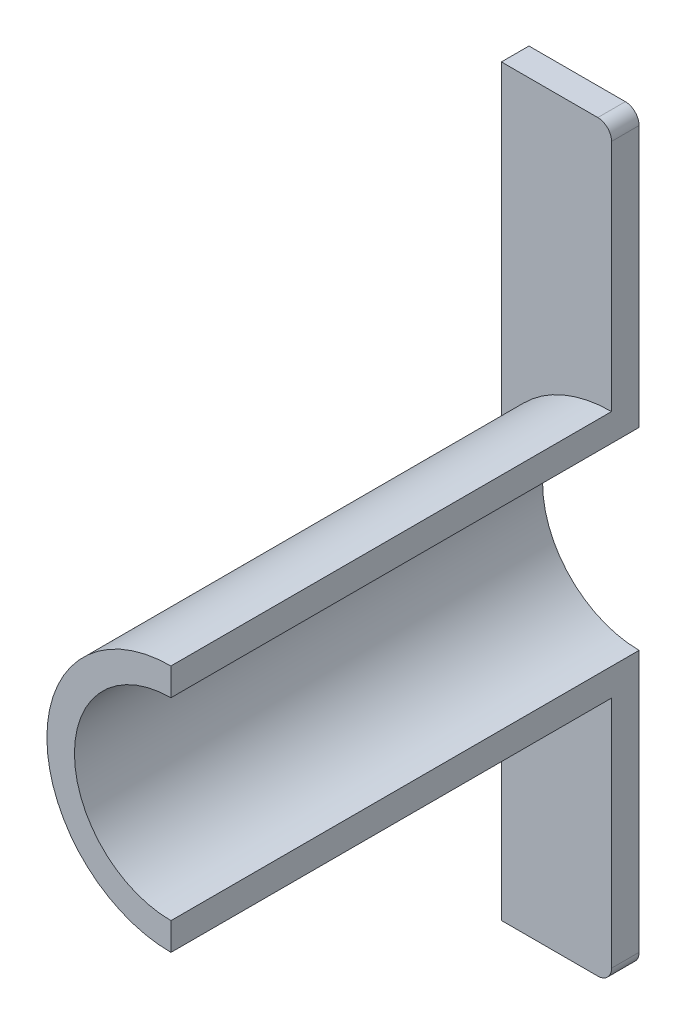
ISO-10303-21;
HEADER;
FILE_DESCRIPTION(('STEP AP214'),'2;1');
FILE_NAME('part.step','',(''),(''),'','','');
FILE_SCHEMA(('AUTOMOTIVE_DESIGN { 1 0 10303 214 1 1 1 1 }'));
ENDSEC;
DATA;
#1=APPLICATION_CONTEXT('core data for automotive mechanical design processes');
#2=APPLICATION_PROTOCOL_DEFINITION('international standard','automotive_design',2000,#1);
#3=PRODUCT_CONTEXT('',#1,'mechanical');
#4=PRODUCT('Part','Part','',(#3));
#5=PRODUCT_RELATED_PRODUCT_CATEGORY('part','',(#4));
#6=PRODUCT_DEFINITION_FORMATION('','',#4);
#7=PRODUCT_DEFINITION_CONTEXT('part definition',#1,'design');
#8=PRODUCT_DEFINITION('design','',#6,#7);
#9=PRODUCT_DEFINITION_SHAPE('','',#8);
#10=(LENGTH_UNIT() NAMED_UNIT(*) SI_UNIT(.MILLI.,.METRE.));
#11=(NAMED_UNIT(*) PLANE_ANGLE_UNIT() SI_UNIT($,.RADIAN.));
#12=(NAMED_UNIT(*) SI_UNIT($,.STERADIAN.) SOLID_ANGLE_UNIT());
#13=UNCERTAINTY_MEASURE_WITH_UNIT(LENGTH_MEASURE(1.E-05),#10,'distance_accuracy_value','');
#14=(GEOMETRIC_REPRESENTATION_CONTEXT(3) GLOBAL_UNCERTAINTY_ASSIGNED_CONTEXT((#13)) GLOBAL_UNIT_ASSIGNED_CONTEXT((#10,
#11,#12)) REPRESENTATION_CONTEXT('',''));
#15=CARTESIAN_POINT('',(0.,0.,0.));
#16=DIRECTION('',(0.,0.,1.));
#17=DIRECTION('',(1.,0.,0.));
#18=AXIS2_PLACEMENT_3D('',#15,#16,#17);
#19=CARTESIAN_POINT('',(1.05,-0.65,0.));
#20=DIRECTION('',(0.,0.,1.));
#21=DIRECTION('',(0.707106781186548,-0.707106781186548,0.));
#22=AXIS2_PLACEMENT_3D('',#19,#20,#21);
#23=CYLINDRICAL_SURFACE('',#22,0.025);
#24=CARTESIAN_POINT('',(1.05,-0.65,0.05));
#25=DIRECTION('',(0.,0.,-1.));
#26=DIRECTION('',(0.707106781186548,-0.707106781186548,0.));
#27=AXIS2_PLACEMENT_3D('',#24,#25,#26);
#28=CIRCLE('',#27,0.025);
#29=CARTESIAN_POINT('',(1.075,-0.65,0.05));
#30=VERTEX_POINT('',#29);
#31=CARTESIAN_POINT('',(1.05,-0.675,0.05));
#32=VERTEX_POINT('',#31);
#33=EDGE_CURVE('E11',#30,#32,#28,.T.);
#34=ORIENTED_EDGE('',*,*,#33,.T.);
#35=DIRECTION('',(0.,0.,-1.));
#36=VECTOR('',#35,1.);
#37=CARTESIAN_POINT('',(1.05,-0.675,0.));
#38=LINE('',#37,#36);
#39=CARTESIAN_POINT('',(1.05,-0.675,0.));
#40=VERTEX_POINT('',#39);
#41=EDGE_CURVE('E24',#32,#40,#38,.T.);
#42=ORIENTED_EDGE('',*,*,#41,.T.);
#43=CARTESIAN_POINT('',(1.05,-0.65,0.));
#44=DIRECTION('',(0.,0.,1.));
#45=DIRECTION('',(0.707106781186548,-0.707106781186548,0.));
#46=AXIS2_PLACEMENT_3D('',#43,#44,#45);
#47=CIRCLE('',#46,0.025);
#48=CARTESIAN_POINT('',(1.075,-0.65,0.));
#49=VERTEX_POINT('',#48);
#50=EDGE_CURVE('E187',#40,#49,#47,.T.);
#51=ORIENTED_EDGE('',*,*,#50,.T.);
#52=DIRECTION('',(0.,0.,1.));
#53=VECTOR('',#52,1.);
#54=CARTESIAN_POINT('',(1.075,-0.65,0.));
#55=LINE('',#54,#53);
#56=EDGE_CURVE('E185',#49,#30,#55,.T.);
#57=ORIENTED_EDGE('',*,*,#56,.T.);
#58=EDGE_LOOP('',(#34,#42,#51,#57));
#59=FACE_BOUND('',#58,.T.);
#60=ADVANCED_FACE('F17',(#59),#23,.T.);
#61=CARTESIAN_POINT('',(0.875,-0.675,0.));
#62=DIRECTION('',(0.,-1.,0.));
#63=DIRECTION('',(1.,0.,0.));
#64=AXIS2_PLACEMENT_3D('',#61,#62,#63);
#65=PLANE('',#64);
#66=ORIENTED_EDGE('',*,*,#41,.F.);
#67=DIRECTION('',(1.,0.,0.));
#68=VECTOR('',#67,1.);
#69=CARTESIAN_POINT('',(-1.075,-0.675,0.05));
#70=LINE('',#69,#68);
#71=CARTESIAN_POINT('',(0.875,-0.675,0.05));
#72=VERTEX_POINT('',#71);
#73=EDGE_CURVE('E183',#72,#32,#70,.T.);
#74=ORIENTED_EDGE('',*,*,#73,.F.);
#75=DIRECTION('',(0.,0.,1.));
#76=VECTOR('',#75,1.);
#77=CARTESIAN_POINT('',(0.875,-0.675,0.));
#78=LINE('',#77,#76);
#79=CARTESIAN_POINT('',(0.875,-0.675,0.));
#80=VERTEX_POINT('',#79);
#81=EDGE_CURVE('E180',#80,#72,#78,.T.);
#82=ORIENTED_EDGE('',*,*,#81,.F.);
#83=DIRECTION('',(1.,0.,0.));
#84=VECTOR('',#83,1.);
#85=CARTESIAN_POINT('',(-1.075,-0.675,0.));
#86=LINE('',#85,#84);
#87=EDGE_CURVE('E177',#80,#40,#86,.T.);
#88=ORIENTED_EDGE('',*,*,#87,.T.);
#89=EDGE_LOOP('',(#66,#74,#82,#88));
#90=FACE_BOUND('',#89,.T.);
#91=ADVANCED_FACE('F195',(#90),#65,.T.);
#92=CARTESIAN_POINT('',(0.975,0.,0.05));
#93=DIRECTION('',(0.,0.,1.));
#94=DIRECTION('',(1.,0.,0.));
#95=AXIS2_PLACEMENT_3D('',#92,#93,#94);
#96=PLANE('',#95);
#97=ORIENTED_EDGE('',*,*,#33,.F.);
#98=DIRECTION('',(0.,1.,0.));
#99=VECTOR('',#98,1.);
#100=CARTESIAN_POINT('',(1.075,-0.675,0.05));
#101=LINE('',#100,#99);
#102=CARTESIAN_POINT('',(1.075,-0.225230326829346,0.05));
#103=VERTEX_POINT('',#102);
#104=EDGE_CURVE('E175',#30,#103,#101,.T.);
#105=ORIENTED_EDGE('',*,*,#104,.T.);
#106=CARTESIAN_POINT('',(1.075,0.,0.05));
#107=DIRECTION('',(0.,0.,-1.));
#108=DIRECTION('',(0.,-1.,0.));
#109=AXIS2_PLACEMENT_3D('',#106,#107,#108);
#110=CIRCLE('',#109,0.225230326829346);
#111=CARTESIAN_POINT('',(0.875,-0.103579438710846,0.05));
#112=VERTEX_POINT('',#111);
#113=EDGE_CURVE('E173',#103,#112,#110,.T.);
#114=ORIENTED_EDGE('',*,*,#113,.T.);
#115=DIRECTION('',(0.,-1.,0.));
#116=VECTOR('',#115,1.);
#117=CARTESIAN_POINT('',(0.875,0.675,0.05));
#118=LINE('',#117,#116);
#119=EDGE_CURVE('E170',#112,#72,#118,.T.);
#120=ORIENTED_EDGE('',*,*,#119,.T.);
#121=ORIENTED_EDGE('',*,*,#73,.T.);
#122=EDGE_LOOP('',(#97,#105,#114,#120,#121));
#123=FACE_BOUND('',#122,.T.);
#124=ADVANCED_FACE('F196',(#123),#96,.T.);
#125=CARTESIAN_POINT('',(1.05,0.65,0.));
#126=DIRECTION('',(0.,0.,1.));
#127=DIRECTION('',(0.707106781186548,0.707106781186548,0.));
#128=AXIS2_PLACEMENT_3D('',#125,#126,#127);
#129=CYLINDRICAL_SURFACE('',#128,0.025);
#130=CARTESIAN_POINT('',(1.05,0.65,0.05));
#131=DIRECTION('',(0.,0.,-1.));
#132=DIRECTION('',(0.707106781186548,0.707106781186548,0.));
#133=AXIS2_PLACEMENT_3D('',#130,#131,#132);
#134=CIRCLE('',#133,0.025);
#135=CARTESIAN_POINT('',(1.05,0.675,0.05));
#136=VERTEX_POINT('',#135);
#137=CARTESIAN_POINT('',(1.075,0.65,0.05));
#138=VERTEX_POINT('',#137);
#139=EDGE_CURVE('E120',#136,#138,#134,.T.);
#140=ORIENTED_EDGE('',*,*,#139,.T.);
#141=DIRECTION('',(0.,0.,-1.));
#142=VECTOR('',#141,1.);
#143=CARTESIAN_POINT('',(1.075,0.65,0.));
#144=LINE('',#143,#142);
#145=CARTESIAN_POINT('',(1.075,0.65,0.));
#146=VERTEX_POINT('',#145);
#147=EDGE_CURVE('E167',#138,#146,#144,.T.);
#148=ORIENTED_EDGE('',*,*,#147,.T.);
#149=CARTESIAN_POINT('',(1.05,0.65,0.));
#150=DIRECTION('',(0.,0.,1.));
#151=DIRECTION('',(0.707106781186548,0.707106781186548,0.));
#152=AXIS2_PLACEMENT_3D('',#149,#150,#151);
#153=CIRCLE('',#152,0.025);
#154=CARTESIAN_POINT('',(1.05,0.675,0.));
#155=VERTEX_POINT('',#154);
#156=EDGE_CURVE('E165',#146,#155,#153,.T.);
#157=ORIENTED_EDGE('',*,*,#156,.T.);
#158=DIRECTION('',(0.,0.,1.));
#159=VECTOR('',#158,1.);
#160=CARTESIAN_POINT('',(1.05,0.675,0.));
#161=LINE('',#160,#159);
#162=EDGE_CURVE('E163',#155,#136,#161,.T.);
#163=ORIENTED_EDGE('',*,*,#162,.T.);
#164=EDGE_LOOP('',(#140,#148,#157,#163));
#165=FACE_BOUND('',#164,.T.);
#166=ADVANCED_FACE('F221',(#165),#129,.T.);
#167=CARTESIAN_POINT('',(0.975,0.,0.));
#168=DIRECTION('',(0.,0.,1.));
#169=DIRECTION('',(1.,0.,0.));
#170=AXIS2_PLACEMENT_3D('',#167,#168,#169);
#171=PLANE('',#170);
#172=ORIENTED_EDGE('',*,*,#50,.F.);
#173=ORIENTED_EDGE('',*,*,#87,.F.);
#174=DIRECTION('',(0.,-1.,0.));
#175=VECTOR('',#174,1.);
#176=CARTESIAN_POINT('',(0.875,0.675,0.));
#177=LINE('',#176,#175);
#178=CARTESIAN_POINT('',(0.875,0.675,0.));
#179=VERTEX_POINT('',#178);
#180=EDGE_CURVE('E161',#179,#80,#177,.T.);
#181=ORIENTED_EDGE('',*,*,#180,.F.);
#182=DIRECTION('',(-1.,0.,0.));
#183=VECTOR('',#182,1.);
#184=CARTESIAN_POINT('',(1.075,0.675,0.));
#185=LINE('',#184,#183);
#186=EDGE_CURVE('E116',#155,#179,#185,.T.);
#187=ORIENTED_EDGE('',*,*,#186,.F.);
#188=ORIENTED_EDGE('',*,*,#156,.F.);
#189=DIRECTION('',(0.,1.,0.));
#190=VECTOR('',#189,1.);
#191=CARTESIAN_POINT('',(1.075,0.175230326829346,0.));
#192=LINE('',#191,#190);
#193=CARTESIAN_POINT('',(1.075,0.175230326829346,0.));
#194=VERTEX_POINT('',#193);
#195=EDGE_CURVE('E157',#194,#146,#192,.T.);
#196=ORIENTED_EDGE('',*,*,#195,.F.);
#197=CARTESIAN_POINT('',(1.075,0.,0.));
#198=DIRECTION('',(0.,0.,-1.));
#199=DIRECTION('',(0.,-1.,0.));
#200=AXIS2_PLACEMENT_3D('',#197,#198,#199);
#201=CIRCLE('',#200,0.175230326829346);
#202=CARTESIAN_POINT('',(1.075,-0.175230326829346,0.));
#203=VERTEX_POINT('',#202);
#204=EDGE_CURVE('E154',#203,#194,#201,.T.);
#205=ORIENTED_EDGE('',*,*,#204,.F.);
#206=DIRECTION('',(0.,1.,0.));
#207=VECTOR('',#206,1.);
#208=CARTESIAN_POINT('',(1.075,-0.675,0.));
#209=LINE('',#208,#207);
#210=EDGE_CURVE('E151',#49,#203,#209,.T.);
#211=ORIENTED_EDGE('',*,*,#210,.F.);
#212=EDGE_LOOP('',(#172,#173,#181,#187,#188,#196,#205,#211));
#213=FACE_BOUND('',#212,.T.);
#214=ADVANCED_FACE('F194',(#213),#171,.F.);
#215=CARTESIAN_POINT('',(1.075,0.175230326829346,0.));
#216=DIRECTION('',(1.,0.,0.));
#217=DIRECTION('',(0.,1.,0.));
#218=AXIS2_PLACEMENT_3D('',#215,#216,#217);
#219=PLANE('',#218);
#220=ORIENTED_EDGE('',*,*,#147,.F.);
#221=DIRECTION('',(0.,1.,0.));
#222=VECTOR('',#221,1.);
#223=CARTESIAN_POINT('',(1.075,0.175230326829346,0.05));
#224=LINE('',#223,#222);
#225=CARTESIAN_POINT('',(1.075,0.225230326829346,0.05));
#226=VERTEX_POINT('',#225);
#227=EDGE_CURVE('E149',#226,#138,#224,.T.);
#228=ORIENTED_EDGE('',*,*,#227,.F.);
#229=DIRECTION('',(0.,0.,1.));
#230=VECTOR('',#229,1.);
#231=CARTESIAN_POINT('',(1.075,0.225230326829346,0.05));
#232=LINE('',#231,#230);
#233=CARTESIAN_POINT('',(1.075,0.225230326829346,0.85));
#234=VERTEX_POINT('',#233);
#235=EDGE_CURVE('E147',#226,#234,#232,.T.);
#236=ORIENTED_EDGE('',*,*,#235,.T.);
#237=DIRECTION('',(0.,-1.,0.));
#238=VECTOR('',#237,1.);
#239=CARTESIAN_POINT('',(1.075,0.225230326829346,0.85));
#240=LINE('',#239,#238);
#241=CARTESIAN_POINT('',(1.075,0.175230326829346,0.85));
#242=VERTEX_POINT('',#241);
#243=EDGE_CURVE('E145',#234,#242,#240,.T.);
#244=ORIENTED_EDGE('',*,*,#243,.T.);
#245=DIRECTION('',(0.,0.,1.));
#246=VECTOR('',#245,1.);
#247=CARTESIAN_POINT('',(1.075,0.175230326829346,0.));
#248=LINE('',#247,#246);
#249=EDGE_CURVE('E142',#194,#242,#248,.T.);
#250=ORIENTED_EDGE('',*,*,#249,.F.);
#251=ORIENTED_EDGE('',*,*,#195,.T.);
#252=EDGE_LOOP('',(#220,#228,#236,#244,#250,#251));
#253=FACE_BOUND('',#252,.T.);
#254=ADVANCED_FACE('F217',(#253),#219,.T.);
#255=CARTESIAN_POINT('',(0.962384836585327,0.,0.05));
#256=DIRECTION('',(0.,0.,-1.));
#257=DIRECTION('',(-1.,0.,0.));
#258=AXIS2_PLACEMENT_3D('',#255,#256,#257);
#259=PLANE('',#258);
#260=DIRECTION('',(0.,-1.,0.));
#261=VECTOR('',#260,1.);
#262=CARTESIAN_POINT('',(0.875,0.675,0.05));
#263=LINE('',#262,#261);
#264=CARTESIAN_POINT('',(0.875,0.103579438710846,0.05));
#265=VERTEX_POINT('',#264);
#266=EDGE_CURVE('E102',#265,#112,#263,.T.);
#267=ORIENTED_EDGE('',*,*,#266,.T.);
#268=CARTESIAN_POINT('',(1.075,0.,0.05));
#269=DIRECTION('',(0.,0.,-1.));
#270=DIRECTION('',(0.,-1.,0.));
#271=AXIS2_PLACEMENT_3D('',#268,#269,#270);
#272=CIRCLE('',#271,0.225230326829346);
#273=EDGE_CURVE('E139',#112,#265,#272,.T.);
#274=ORIENTED_EDGE('',*,*,#273,.T.);
#275=EDGE_LOOP('',(#267,#274));
#276=FACE_BOUND('',#275,.T.);
#277=ADVANCED_FACE('F268',(#276),#259,.T.);
#278=CARTESIAN_POINT('',(1.075,0.,0.05));
#279=DIRECTION('',(0.,0.,-1.));
#280=DIRECTION('',(0.,-1.,0.));
#281=AXIS2_PLACEMENT_3D('',#278,#279,#280);
#282=CYLINDRICAL_SURFACE('',#281,0.225230326829346);
#283=ORIENTED_EDGE('',*,*,#113,.F.);
#284=DIRECTION('',(0.,0.,1.));
#285=VECTOR('',#284,1.);
#286=CARTESIAN_POINT('',(1.075,-0.225230326829346,0.05));
#287=LINE('',#286,#285);
#288=CARTESIAN_POINT('',(1.075,-0.225230326829346,0.85));
#289=VERTEX_POINT('',#288);
#290=EDGE_CURVE('E137',#103,#289,#287,.T.);
#291=ORIENTED_EDGE('',*,*,#290,.T.);
#292=CARTESIAN_POINT('',(1.075,0.,0.85));
#293=DIRECTION('',(0.,0.,-1.));
#294=DIRECTION('',(0.,-1.,0.));
#295=AXIS2_PLACEMENT_3D('',#292,#293,#294);
#296=CIRCLE('',#295,0.225230326829346);
#297=EDGE_CURVE('E134',#289,#234,#296,.T.);
#298=ORIENTED_EDGE('',*,*,#297,.T.);
#299=ORIENTED_EDGE('',*,*,#235,.F.);
#300=CARTESIAN_POINT('',(1.075,0.,0.05));
#301=DIRECTION('',(0.,0.,-1.));
#302=DIRECTION('',(0.,-1.,0.));
#303=AXIS2_PLACEMENT_3D('',#300,#301,#302);
#304=CIRCLE('',#303,0.225230326829346);
#305=EDGE_CURVE('E132',#265,#226,#304,.T.);
#306=ORIENTED_EDGE('',*,*,#305,.F.);
#307=ORIENTED_EDGE('',*,*,#273,.F.);
#308=EDGE_LOOP('',(#283,#291,#298,#299,#306,#307));
#309=FACE_BOUND('',#308,.T.);
#310=ADVANCED_FACE('F202',(#309),#282,.T.);
#311=CARTESIAN_POINT('',(0.962384836585327,0.,0.85));
#312=DIRECTION('',(0.,0.,-1.));
#313=DIRECTION('',(-1.,0.,0.));
#314=AXIS2_PLACEMENT_3D('',#311,#312,#313);
#315=PLANE('',#314);
#316=DIRECTION('',(0.,-1.,0.));
#317=VECTOR('',#316,1.);
#318=CARTESIAN_POINT('',(1.075,-0.175230326829346,0.85));
#319=LINE('',#318,#317);
#320=CARTESIAN_POINT('',(1.075,-0.175230326829346,0.85));
#321=VERTEX_POINT('',#320);
#322=EDGE_CURVE('E129',#321,#289,#319,.T.);
#323=ORIENTED_EDGE('',*,*,#322,.F.);
#324=CARTESIAN_POINT('',(1.075,0.,0.85));
#325=DIRECTION('',(0.,0.,1.));
#326=DIRECTION('',(0.,1.,0.));
#327=AXIS2_PLACEMENT_3D('',#324,#325,#326);
#328=CIRCLE('',#327,0.175230326829346);
#329=EDGE_CURVE('E126',#242,#321,#328,.T.);
#330=ORIENTED_EDGE('',*,*,#329,.F.);
#331=ORIENTED_EDGE('',*,*,#243,.F.);
#332=ORIENTED_EDGE('',*,*,#297,.F.);
#333=EDGE_LOOP('',(#323,#330,#331,#332));
#334=FACE_BOUND('',#333,.T.);
#335=ADVANCED_FACE('F210',(#334),#315,.F.);
#336=CARTESIAN_POINT('',(1.075,0.,0.));
#337=DIRECTION('',(0.,0.,1.));
#338=DIRECTION('',(0.,-1.,0.));
#339=AXIS2_PLACEMENT_3D('',#336,#337,#338);
#340=CYLINDRICAL_SURFACE('',#339,0.175230326829346);
#341=ORIENTED_EDGE('',*,*,#204,.T.);
#342=ORIENTED_EDGE('',*,*,#249,.T.);
#343=ORIENTED_EDGE('',*,*,#329,.T.);
#344=DIRECTION('',(0.,0.,1.));
#345=VECTOR('',#344,1.);
#346=CARTESIAN_POINT('',(1.075,-0.175230326829346,0.));
#347=LINE('',#346,#345);
#348=EDGE_CURVE('E107',#203,#321,#347,.T.);
#349=ORIENTED_EDGE('',*,*,#348,.F.);
#350=EDGE_LOOP('',(#341,#342,#343,#349));
#351=FACE_BOUND('',#350,.T.);
#352=ADVANCED_FACE('F213',(#351),#340,.F.);
#353=CARTESIAN_POINT('',(1.075,-0.675,0.));
#354=DIRECTION('',(1.,0.,0.));
#355=DIRECTION('',(0.,1.,0.));
#356=AXIS2_PLACEMENT_3D('',#353,#354,#355);
#357=PLANE('',#356);
#358=ORIENTED_EDGE('',*,*,#56,.F.);
#359=ORIENTED_EDGE('',*,*,#210,.T.);
#360=ORIENTED_EDGE('',*,*,#348,.T.);
#361=ORIENTED_EDGE('',*,*,#322,.T.);
#362=ORIENTED_EDGE('',*,*,#290,.F.);
#363=ORIENTED_EDGE('',*,*,#104,.F.);
#364=EDGE_LOOP('',(#358,#359,#360,#361,#362,#363));
#365=FACE_BOUND('',#364,.T.);
#366=ADVANCED_FACE('F206',(#365),#357,.T.);
#367=CARTESIAN_POINT('',(0.875,0.675,0.));
#368=DIRECTION('',(-1.,0.,0.));
#369=DIRECTION('',(0.,-1.,0.));
#370=AXIS2_PLACEMENT_3D('',#367,#368,#369);
#371=PLANE('',#370);
#372=ORIENTED_EDGE('',*,*,#180,.T.);
#373=ORIENTED_EDGE('',*,*,#81,.T.);
#374=ORIENTED_EDGE('',*,*,#119,.F.);
#375=ORIENTED_EDGE('',*,*,#266,.F.);
#376=DIRECTION('',(0.,-1.,0.));
#377=VECTOR('',#376,1.);
#378=CARTESIAN_POINT('',(0.875,0.675,0.05));
#379=LINE('',#378,#377);
#380=CARTESIAN_POINT('',(0.875,0.675,0.05));
#381=VERTEX_POINT('',#380);
#382=EDGE_CURVE('E95',#381,#265,#379,.T.);
#383=ORIENTED_EDGE('',*,*,#382,.F.);
#384=DIRECTION('',(0.,0.,1.));
#385=VECTOR('',#384,1.);
#386=CARTESIAN_POINT('',(0.875,0.675,0.));
#387=LINE('',#386,#385);
#388=EDGE_CURVE('E99',#179,#381,#387,.T.);
#389=ORIENTED_EDGE('',*,*,#388,.F.);
#390=EDGE_LOOP('',(#372,#373,#374,#375,#383,#389));
#391=FACE_BOUND('',#390,.T.);
#392=ADVANCED_FACE('F98',(#391),#371,.T.);
#393=CARTESIAN_POINT('',(1.075,0.675,0.));
#394=DIRECTION('',(0.,1.,0.));
#395=DIRECTION('',(-1.,0.,0.));
#396=AXIS2_PLACEMENT_3D('',#393,#394,#395);
#397=PLANE('',#396);
#398=ORIENTED_EDGE('',*,*,#162,.F.);
#399=ORIENTED_EDGE('',*,*,#186,.T.);
#400=ORIENTED_EDGE('',*,*,#388,.T.);
#401=DIRECTION('',(-1.,0.,0.));
#402=VECTOR('',#401,1.);
#403=CARTESIAN_POINT('',(1.075,0.675,0.05));
#404=LINE('',#403,#402);
#405=EDGE_CURVE('E114',#136,#381,#404,.T.);
#406=ORIENTED_EDGE('',*,*,#405,.F.);
#407=EDGE_LOOP('',(#398,#399,#400,#406));
#408=FACE_BOUND('',#407,.T.);
#409=ADVANCED_FACE('F113',(#408),#397,.T.);
#410=CARTESIAN_POINT('',(0.975,0.,0.05));
#411=DIRECTION('',(0.,0.,1.));
#412=DIRECTION('',(1.,0.,0.));
#413=AXIS2_PLACEMENT_3D('',#410,#411,#412);
#414=PLANE('',#413);
#415=ORIENTED_EDGE('',*,*,#139,.F.);
#416=ORIENTED_EDGE('',*,*,#405,.T.);
#417=ORIENTED_EDGE('',*,*,#382,.T.);
#418=ORIENTED_EDGE('',*,*,#305,.T.);
#419=ORIENTED_EDGE('',*,*,#227,.T.);
#420=EDGE_LOOP('',(#415,#416,#417,#418,#419));
#421=FACE_BOUND('',#420,.T.);
#422=ADVANCED_FACE('F118',(#421),#414,.T.);
#423=CLOSED_SHELL('',(#60,#91,#124,#166,#214,#254,#277,#310,#335,#352,#366,#392,#409,#422));
#424=MANIFOLD_SOLID_BREP('B1',#423);
#425=ADVANCED_BREP_SHAPE_REPRESENTATION('',(#18,#424),#14);
#426=SHAPE_DEFINITION_REPRESENTATION(#9,#425);
ENDSEC;
END-ISO-10303-21;
